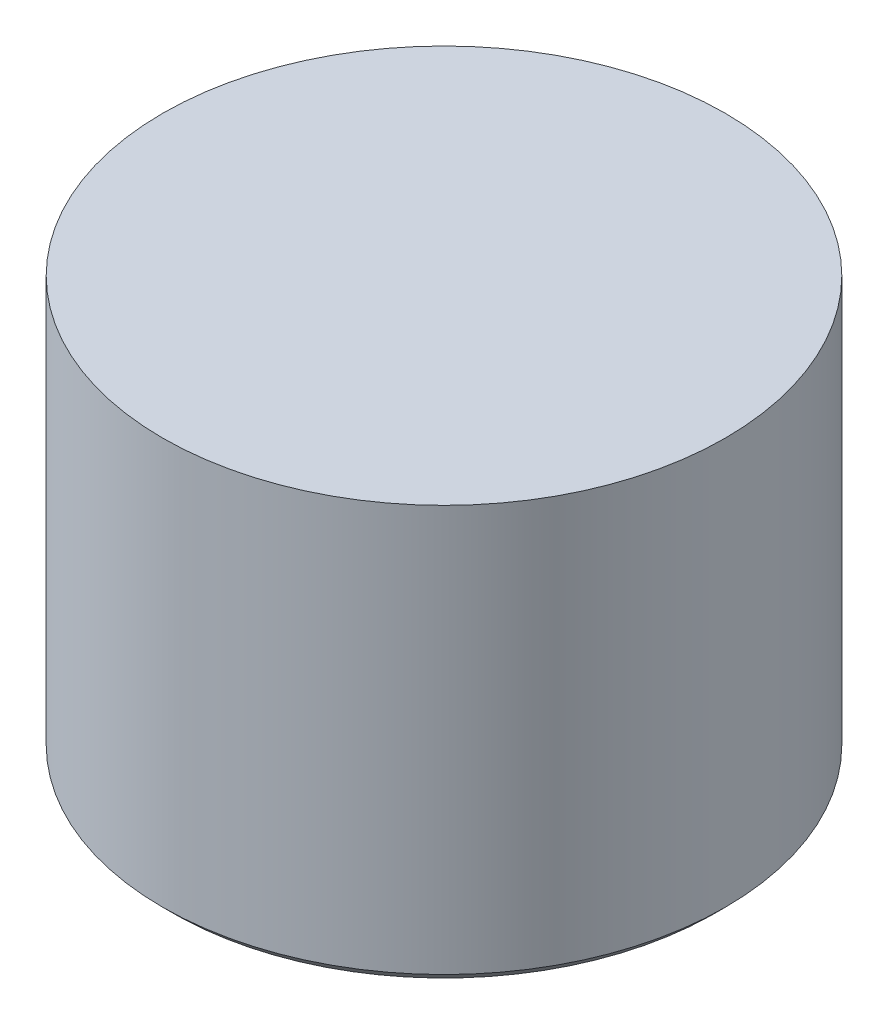
ISO-10303-21;
HEADER;
FILE_DESCRIPTION(('STEP AP214'),'2;1');
FILE_NAME('part.step','',(''),(''),'','','');
FILE_SCHEMA(('AUTOMOTIVE_DESIGN { 1 0 10303 214 1 1 1 1 }'));
ENDSEC;
DATA;
#1=APPLICATION_CONTEXT('core data for automotive mechanical design processes');
#2=APPLICATION_PROTOCOL_DEFINITION('international standard','automotive_design',2000,#1);
#3=PRODUCT_CONTEXT('',#1,'mechanical');
#4=PRODUCT('Part','Part','',(#3));
#5=PRODUCT_RELATED_PRODUCT_CATEGORY('part','',(#4));
#6=PRODUCT_DEFINITION_FORMATION('','',#4);
#7=PRODUCT_DEFINITION_CONTEXT('part definition',#1,'design');
#8=PRODUCT_DEFINITION('design','',#6,#7);
#9=PRODUCT_DEFINITION_SHAPE('','',#8);
#10=(LENGTH_UNIT() NAMED_UNIT(*) SI_UNIT(.MILLI.,.METRE.));
#11=(NAMED_UNIT(*) PLANE_ANGLE_UNIT() SI_UNIT($,.RADIAN.));
#12=(NAMED_UNIT(*) SI_UNIT($,.STERADIAN.) SOLID_ANGLE_UNIT());
#13=UNCERTAINTY_MEASURE_WITH_UNIT(LENGTH_MEASURE(1.E-05),#10,'distance_accuracy_value','');
#14=(GEOMETRIC_REPRESENTATION_CONTEXT(3) GLOBAL_UNCERTAINTY_ASSIGNED_CONTEXT((#13)) GLOBAL_UNIT_ASSIGNED_CONTEXT((#10,
#11,#12)) REPRESENTATION_CONTEXT('',''));
#15=CARTESIAN_POINT('',(0.,0.,0.));
#16=DIRECTION('',(0.,0.,1.));
#17=DIRECTION('',(1.,0.,0.));
#18=AXIS2_PLACEMENT_3D('',#15,#16,#17);
#19=CARTESIAN_POINT('',(13.5,20.,0.));
#20=DIRECTION('',(0.,1.,0.));
#21=DIRECTION('',(0.,0.,1.));
#22=AXIS2_PLACEMENT_3D('',#19,#20,#21);
#23=PLANE('',#22);
#24=CARTESIAN_POINT('',(0.,20.,0.));
#25=DIRECTION('',(0.,-1.,0.));
#26=DIRECTION('',(0.,0.,-1.));
#27=AXIS2_PLACEMENT_3D('',#24,#25,#26);
#28=CIRCLE('',#27,13.5);
#29=CARTESIAN_POINT('',(0.,20.,-13.5));
#30=VERTEX_POINT('',#29);
#31=EDGE_CURVE('E71',#30,#30,#28,.T.);
#32=ORIENTED_EDGE('',*,*,#31,.F.);
#33=EDGE_LOOP('',(#32));
#34=FACE_BOUND('',#33,.T.);
#35=ADVANCED_FACE('F34',(#34),#23,.T.);
#36=CARTESIAN_POINT('',(0.,18.,0.));
#37=DIRECTION('',(0.,-1.,0.));
#38=DIRECTION('',(0.,0.,-1.));
#39=AXIS2_PLACEMENT_3D('',#36,#37,#38);
#40=PLANE('',#39);
#41=CARTESIAN_POINT('',(0.,18.,0.));
#42=DIRECTION('',(0.,-1.,0.));
#43=DIRECTION('',(0.,0.,-1.));
#44=AXIS2_PLACEMENT_3D('',#41,#42,#43);
#45=CIRCLE('',#44,1.5);
#46=CARTESIAN_POINT('',(0.,18.,-1.5));
#47=VERTEX_POINT('',#46);
#48=EDGE_CURVE('E10',#47,#47,#45,.T.);
#49=ORIENTED_EDGE('',*,*,#48,.T.);
#50=EDGE_LOOP('',(#49));
#51=FACE_BOUND('',#50,.T.);
#52=ADVANCED_FACE('F79',(#51),#40,.T.);
#53=CARTESIAN_POINT('',(0.,0.,0.));
#54=DIRECTION('',(0.,-1.,0.));
#55=DIRECTION('',(0.,0.,-1.));
#56=AXIS2_PLACEMENT_3D('',#53,#54,#55);
#57=CYLINDRICAL_SURFACE('',#56,1.5);
#58=CARTESIAN_POINT('',(0.,13.,0.));
#59=DIRECTION('',(0.,-1.,0.));
#60=DIRECTION('',(0.,0.,-1.));
#61=AXIS2_PLACEMENT_3D('',#58,#59,#60);
#62=CIRCLE('',#61,1.5);
#63=CARTESIAN_POINT('',(0.,13.,-1.5));
#64=VERTEX_POINT('',#63);
#65=EDGE_CURVE('E40',#64,#64,#62,.T.);
#66=ORIENTED_EDGE('',*,*,#65,.T.);
#67=EDGE_LOOP('',(#66));
#68=FACE_BOUND('',#67,.T.);
#69=ORIENTED_EDGE('',*,*,#48,.F.);
#70=EDGE_LOOP('',(#69));
#71=FACE_BOUND('',#70,.T.);
#72=ADVANCED_FACE('F83',(#68,#71),#57,.F.);
#73=CARTESIAN_POINT('',(1.5,13.,0.));
#74=DIRECTION('',(0.,-1.,0.));
#75=DIRECTION('',(0.,0.,-1.));
#76=AXIS2_PLACEMENT_3D('',#73,#74,#75);
#77=PLANE('',#76);
#78=CARTESIAN_POINT('',(0.,13.,0.));
#79=DIRECTION('',(0.,-1.,0.));
#80=DIRECTION('',(0.,0.,-1.));
#81=AXIS2_PLACEMENT_3D('',#78,#79,#80);
#82=CIRCLE('',#81,3.);
#83=CARTESIAN_POINT('',(0.,13.,-3.));
#84=VERTEX_POINT('',#83);
#85=EDGE_CURVE('E44',#84,#84,#82,.T.);
#86=ORIENTED_EDGE('',*,*,#85,.T.);
#87=EDGE_LOOP('',(#86));
#88=FACE_BOUND('',#87,.T.);
#89=ORIENTED_EDGE('',*,*,#65,.F.);
#90=EDGE_LOOP('',(#89));
#91=FACE_BOUND('',#90,.T.);
#92=ADVANCED_FACE('F87',(#88,#91),#77,.T.);
#93=CARTESIAN_POINT('',(0.,0.,0.));
#94=DIRECTION('',(0.,-1.,0.));
#95=DIRECTION('',(0.,0.,-1.));
#96=AXIS2_PLACEMENT_3D('',#93,#94,#95);
#97=CYLINDRICAL_SURFACE('',#96,3.);
#98=CARTESIAN_POINT('',(0.,15.,0.));
#99=DIRECTION('',(0.,-1.,0.));
#100=DIRECTION('',(0.,0.,-1.));
#101=AXIS2_PLACEMENT_3D('',#98,#99,#100);
#102=CIRCLE('',#101,3.);
#103=CARTESIAN_POINT('',(0.,15.,-3.));
#104=VERTEX_POINT('',#103);
#105=EDGE_CURVE('E48',#104,#104,#102,.T.);
#106=ORIENTED_EDGE('',*,*,#105,.T.);
#107=EDGE_LOOP('',(#106));
#108=FACE_BOUND('',#107,.T.);
#109=ORIENTED_EDGE('',*,*,#85,.F.);
#110=EDGE_LOOP('',(#109));
#111=FACE_BOUND('',#110,.T.);
#112=ADVANCED_FACE('F92',(#108,#111),#97,.T.);
#113=CARTESIAN_POINT('',(0.,15.,0.));
#114=DIRECTION('',(0.,1.,0.));
#115=DIRECTION('',(0.,0.,1.));
#116=AXIS2_PLACEMENT_3D('',#113,#114,#115);
#117=CONICAL_SURFACE('',#116,3.,0.785398163397449);
#118=CARTESIAN_POINT('',(0.,18.,0.));
#119=DIRECTION('',(0.,-1.,0.));
#120=DIRECTION('',(0.,0.,-1.));
#121=AXIS2_PLACEMENT_3D('',#118,#119,#120);
#122=CIRCLE('',#121,6.);
#123=CARTESIAN_POINT('',(0.,18.,-6.));
#124=VERTEX_POINT('',#123);
#125=EDGE_CURVE('E53',#124,#124,#122,.T.);
#126=ORIENTED_EDGE('',*,*,#125,.T.);
#127=EDGE_LOOP('',(#126));
#128=FACE_BOUND('',#127,.T.);
#129=ORIENTED_EDGE('',*,*,#105,.F.);
#130=EDGE_LOOP('',(#129));
#131=FACE_BOUND('',#130,.T.);
#132=ADVANCED_FACE('F96',(#128,#131),#117,.T.);
#133=CARTESIAN_POINT('',(6.,18.,0.));
#134=DIRECTION('',(0.,-1.,0.));
#135=DIRECTION('',(0.,0.,-1.));
#136=AXIS2_PLACEMENT_3D('',#133,#134,#135);
#137=PLANE('',#136);
#138=CARTESIAN_POINT('',(0.,18.,0.));
#139=DIRECTION('',(0.,-1.,0.));
#140=DIRECTION('',(0.,0.,-1.));
#141=AXIS2_PLACEMENT_3D('',#138,#139,#140);
#142=CIRCLE('',#141,9.5);
#143=CARTESIAN_POINT('',(0.,18.,-9.5));
#144=VERTEX_POINT('',#143);
#145=EDGE_CURVE('E56',#144,#144,#142,.T.);
#146=ORIENTED_EDGE('',*,*,#145,.T.);
#147=EDGE_LOOP('',(#146));
#148=FACE_BOUND('',#147,.T.);
#149=ORIENTED_EDGE('',*,*,#125,.F.);
#150=EDGE_LOOP('',(#149));
#151=FACE_BOUND('',#150,.T.);
#152=ADVANCED_FACE('F100',(#148,#151),#137,.T.);
#153=CARTESIAN_POINT('',(0.,18.,0.));
#154=DIRECTION('',(0.,-1.,0.));
#155=DIRECTION('',(0.,0.,-1.));
#156=AXIS2_PLACEMENT_3D('',#153,#154,#155);
#157=CONICAL_SURFACE('',#156,9.5,0.785398163397448);
#158=CARTESIAN_POINT('',(0.,15.,0.));
#159=DIRECTION('',(0.,-1.,0.));
#160=DIRECTION('',(0.,0.,-1.));
#161=AXIS2_PLACEMENT_3D('',#158,#159,#160);
#162=CIRCLE('',#161,12.5);
#163=CARTESIAN_POINT('',(0.,15.,-12.5));
#164=VERTEX_POINT('',#163);
#165=EDGE_CURVE('E59',#164,#164,#162,.T.);
#166=ORIENTED_EDGE('',*,*,#165,.T.);
#167=EDGE_LOOP('',(#166));
#168=FACE_BOUND('',#167,.T.);
#169=ORIENTED_EDGE('',*,*,#145,.F.);
#170=EDGE_LOOP('',(#169));
#171=FACE_BOUND('',#170,.T.);
#172=ADVANCED_FACE('F104',(#168,#171),#157,.F.);
#173=CARTESIAN_POINT('',(0.,0.,0.));
#174=DIRECTION('',(0.,-1.,0.));
#175=DIRECTION('',(0.,0.,-1.));
#176=AXIS2_PLACEMENT_3D('',#173,#174,#175);
#177=CYLINDRICAL_SURFACE('',#176,12.5);
#178=CARTESIAN_POINT('',(0.,0.,0.));
#179=DIRECTION('',(0.,-1.,0.));
#180=DIRECTION('',(0.,0.,-1.));
#181=AXIS2_PLACEMENT_3D('',#178,#179,#180);
#182=CIRCLE('',#181,12.5);
#183=CARTESIAN_POINT('',(0.,0.,-12.5));
#184=VERTEX_POINT('',#183);
#185=EDGE_CURVE('E62',#184,#184,#182,.T.);
#186=ORIENTED_EDGE('',*,*,#185,.T.);
#187=EDGE_LOOP('',(#186));
#188=FACE_BOUND('',#187,.T.);
#189=ORIENTED_EDGE('',*,*,#165,.F.);
#190=EDGE_LOOP('',(#189));
#191=FACE_BOUND('',#190,.T.);
#192=ADVANCED_FACE('F108',(#188,#191),#177,.F.);
#193=CARTESIAN_POINT('',(12.5,0.,0.));
#194=DIRECTION('',(0.,-1.,0.));
#195=DIRECTION('',(0.,0.,-1.));
#196=AXIS2_PLACEMENT_3D('',#193,#194,#195);
#197=PLANE('',#196);
#198=CARTESIAN_POINT('',(0.,0.,0.));
#199=DIRECTION('',(0.,-1.,0.));
#200=DIRECTION('',(0.,0.,-1.));
#201=AXIS2_PLACEMENT_3D('',#198,#199,#200);
#202=CIRCLE('',#201,13.);
#203=CARTESIAN_POINT('',(0.,0.,-13.));
#204=VERTEX_POINT('',#203);
#205=EDGE_CURVE('E65',#204,#204,#202,.T.);
#206=ORIENTED_EDGE('',*,*,#205,.T.);
#207=EDGE_LOOP('',(#206));
#208=FACE_BOUND('',#207,.T.);
#209=ORIENTED_EDGE('',*,*,#185,.F.);
#210=EDGE_LOOP('',(#209));
#211=FACE_BOUND('',#210,.T.);
#212=ADVANCED_FACE('F112',(#208,#211),#197,.T.);
#213=CARTESIAN_POINT('',(0.,0.,0.));
#214=DIRECTION('',(0.,1.,0.));
#215=DIRECTION('',(0.,0.,1.));
#216=AXIS2_PLACEMENT_3D('',#213,#214,#215);
#217=CONICAL_SURFACE('',#216,13.,0.785398163397449);
#218=CARTESIAN_POINT('',(0.,0.5,0.));
#219=DIRECTION('',(0.,-1.,0.));
#220=DIRECTION('',(0.,0.,-1.));
#221=AXIS2_PLACEMENT_3D('',#218,#219,#220);
#222=CIRCLE('',#221,13.5);
#223=CARTESIAN_POINT('',(0.,0.5,-13.5));
#224=VERTEX_POINT('',#223);
#225=EDGE_CURVE('E68',#224,#224,#222,.T.);
#226=ORIENTED_EDGE('',*,*,#225,.T.);
#227=EDGE_LOOP('',(#226));
#228=FACE_BOUND('',#227,.T.);
#229=ORIENTED_EDGE('',*,*,#205,.F.);
#230=EDGE_LOOP('',(#229));
#231=FACE_BOUND('',#230,.T.);
#232=ADVANCED_FACE('F116',(#228,#231),#217,.T.);
#233=CARTESIAN_POINT('',(0.,0.,0.));
#234=DIRECTION('',(0.,-1.,0.));
#235=DIRECTION('',(0.,0.,-1.));
#236=AXIS2_PLACEMENT_3D('',#233,#234,#235);
#237=CYLINDRICAL_SURFACE('',#236,13.5);
#238=ORIENTED_EDGE('',*,*,#31,.T.);
#239=EDGE_LOOP('',(#238));
#240=FACE_BOUND('',#239,.T.);
#241=ORIENTED_EDGE('',*,*,#225,.F.);
#242=EDGE_LOOP('',(#241));
#243=FACE_BOUND('',#242,.T.);
#244=ADVANCED_FACE('F75',(#240,#243),#237,.T.);
#245=CLOSED_SHELL('',(#35,#52,#72,#92,#112,#132,#152,#172,#192,#212,#232,#244));
#246=MANIFOLD_SOLID_BREP('B2',#245);
#247=ADVANCED_BREP_SHAPE_REPRESENTATION('',(#18,#246),#14);
#248=SHAPE_DEFINITION_REPRESENTATION(#9,#247);
ENDSEC;
END-ISO-10303-21;
